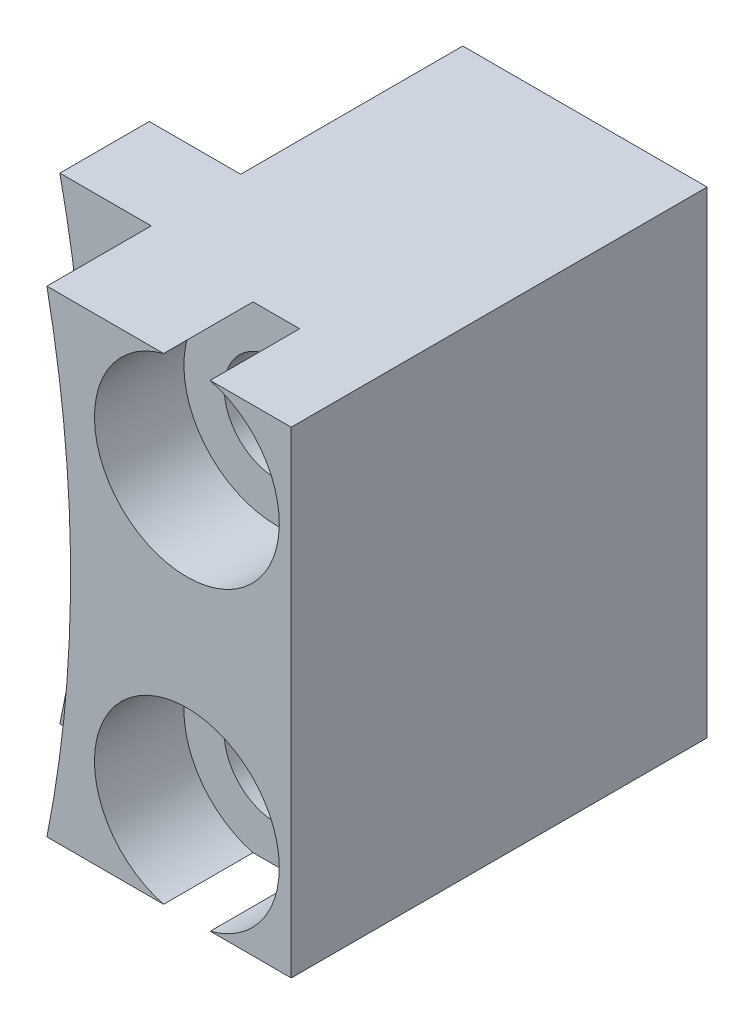
ISO-10303-21;
HEADER;
FILE_DESCRIPTION(('STEP AP214'),'2;1');
FILE_NAME('part.step','',(''),(''),'','','');
FILE_SCHEMA(('AUTOMOTIVE_DESIGN { 1 0 10303 214 1 1 1 1 }'));
ENDSEC;
DATA;
#1=APPLICATION_CONTEXT('core data for automotive mechanical design processes');
#2=APPLICATION_PROTOCOL_DEFINITION('international standard','automotive_design',2000,#1);
#3=PRODUCT_CONTEXT('',#1,'mechanical');
#4=PRODUCT('Part','Part','',(#3));
#5=PRODUCT_RELATED_PRODUCT_CATEGORY('part','',(#4));
#6=PRODUCT_DEFINITION_FORMATION('','',#4);
#7=PRODUCT_DEFINITION_CONTEXT('part definition',#1,'design');
#8=PRODUCT_DEFINITION('design','',#6,#7);
#9=PRODUCT_DEFINITION_SHAPE('','',#8);
#10=(LENGTH_UNIT() NAMED_UNIT(*) SI_UNIT(.MILLI.,.METRE.));
#11=(NAMED_UNIT(*) PLANE_ANGLE_UNIT() SI_UNIT($,.RADIAN.));
#12=(NAMED_UNIT(*) SI_UNIT($,.STERADIAN.) SOLID_ANGLE_UNIT());
#13=UNCERTAINTY_MEASURE_WITH_UNIT(LENGTH_MEASURE(1.E-05),#10,'distance_accuracy_value','');
#14=(GEOMETRIC_REPRESENTATION_CONTEXT(3) GLOBAL_UNCERTAINTY_ASSIGNED_CONTEXT((#13)) GLOBAL_UNIT_ASSIGNED_CONTEXT((#10,
#11,#12)) REPRESENTATION_CONTEXT('',''));
#15=CARTESIAN_POINT('',(0.,0.,0.));
#16=DIRECTION('',(0.,0.,1.));
#17=DIRECTION('',(1.,0.,0.));
#18=AXIS2_PLACEMENT_3D('',#15,#16,#17);
#19=CARTESIAN_POINT('',(44.5,5.,57.));
#20=DIRECTION('',(0.,0.,1.));
#21=DIRECTION('',(1.,0.,0.));
#22=AXIS2_PLACEMENT_3D('',#19,#20,#21);
#23=PLANE('',#22);
#24=CARTESIAN_POINT('',(44.5,5.,57.));
#25=DIRECTION('',(0.,0.,1.));
#26=DIRECTION('',(1.,0.,0.));
#27=AXIS2_PLACEMENT_3D('',#24,#25,#26);
#28=CIRCLE('',#27,1.75);
#29=CARTESIAN_POINT('',(46.25,5.,57.));
#30=VERTEX_POINT('',#29);
#31=EDGE_CURVE('E19',#30,#30,#28,.T.);
#32=ORIENTED_EDGE('',*,*,#31,.F.);
#33=EDGE_LOOP('',(#32));
#34=FACE_BOUND('',#33,.T.);
#35=DIRECTION('',(1.,0.,0.));
#36=VECTOR('',#35,1.);
#37=CARTESIAN_POINT('',(41.25,8.,57.));
#38=LINE('',#37,#36);
#39=CARTESIAN_POINT('',(43.718975032409,8.,57.));
#40=VERTEX_POINT('',#39);
#41=CARTESIAN_POINT('',(45.281024967591,8.,57.));
#42=VERTEX_POINT('',#41);
#43=EDGE_CURVE('E237',#40,#42,#38,.T.);
#44=ORIENTED_EDGE('',*,*,#43,.F.);
#45=CARTESIAN_POINT('',(44.5,5.,57.));
#46=DIRECTION('',(0.,0.,-1.));
#47=DIRECTION('',(0.251943537931998,0.967741935483994,0.));
#48=AXIS2_PLACEMENT_3D('',#45,#46,#47);
#49=CIRCLE('',#48,3.1);
#50=EDGE_CURVE('E10',#42,#40,#49,.T.);
#51=ORIENTED_EDGE('',*,*,#50,.F.);
#52=EDGE_LOOP('',(#44,#51));
#53=FACE_BOUND('',#52,.T.);
#54=ADVANCED_FACE('F16',(#34,#53),#23,.T.);
#55=CARTESIAN_POINT('',(44.5,5.,57.));
#56=DIRECTION('',(0.,0.,1.));
#57=DIRECTION('',(1.,0.,0.));
#58=AXIS2_PLACEMENT_3D('',#55,#56,#57);
#59=CYLINDRICAL_SURFACE('',#58,3.1);
#60=DIRECTION('',(0.,0.,1.));
#61=VECTOR('',#60,1.);
#62=CARTESIAN_POINT('',(43.718975032409,8.,57.));
#63=LINE('',#62,#61);
#64=CARTESIAN_POINT('',(43.71897503241,8.,60.));
#65=VERTEX_POINT('',#64);
#66=EDGE_CURVE('E234',#40,#65,#63,.T.);
#67=ORIENTED_EDGE('',*,*,#66,.T.);
#68=CARTESIAN_POINT('',(44.5,5.,60.));
#69=DIRECTION('',(0.,0.,-1.));
#70=DIRECTION('',(0.251943537931998,0.967741935483994,0.));
#71=AXIS2_PLACEMENT_3D('',#68,#69,#70);
#72=CIRCLE('',#71,3.1);
#73=CARTESIAN_POINT('',(45.28102496759,8.,60.));
#74=VERTEX_POINT('',#73);
#75=EDGE_CURVE('E161',#74,#65,#72,.T.);
#76=ORIENTED_EDGE('',*,*,#75,.F.);
#77=DIRECTION('',(0.,0.,1.));
#78=VECTOR('',#77,1.);
#79=CARTESIAN_POINT('',(45.281024967591,8.,57.));
#80=LINE('',#79,#78);
#81=EDGE_CURVE('E156',#42,#74,#80,.T.);
#82=ORIENTED_EDGE('',*,*,#81,.F.);
#83=ORIENTED_EDGE('',*,*,#50,.T.);
#84=EDGE_LOOP('',(#67,#76,#82,#83));
#85=FACE_BOUND('',#84,.T.);
#86=ADVANCED_FACE('F281',(#85),#59,.F.);
#87=CARTESIAN_POINT('',(44.5,5.,46.));
#88=DIRECTION('',(0.,0.,1.));
#89=DIRECTION('',(1.,0.,0.));
#90=AXIS2_PLACEMENT_3D('',#87,#88,#89);
#91=CYLINDRICAL_SURFACE('',#90,1.75);
#92=DIRECTION('',(0.,0.,1.));
#93=VECTOR('',#92,1.);
#94=CARTESIAN_POINT('',(46.25,5.,46.));
#95=LINE('',#94,#93);
#96=CARTESIAN_POINT('',(46.25,5.,46.05));
#97=VERTEX_POINT('',#96);
#98=EDGE_CURVE('E244',#97,#30,#95,.T.);
#99=ORIENTED_EDGE('',*,*,#98,.F.);
#100=CARTESIAN_POINT('',(44.5,5.,46.05));
#101=DIRECTION('',(0.,0.,1.));
#102=DIRECTION('',(1.,0.,0.));
#103=AXIS2_PLACEMENT_3D('',#100,#101,#102);
#104=CIRCLE('',#103,1.75);
#105=EDGE_CURVE('E180',#97,#97,#104,.T.);
#106=ORIENTED_EDGE('',*,*,#105,.F.);
#107=ORIENTED_EDGE('',*,*,#98,.T.);
#108=ORIENTED_EDGE('',*,*,#31,.T.);
#109=EDGE_LOOP('',(#99,#106,#107,#108));
#110=FACE_BOUND('',#109,.T.);
#111=ADVANCED_FACE('F276',(#110),#91,.F.);
#112=CARTESIAN_POINT('',(44.5,-5.,46.));
#113=DIRECTION('',(0.,0.,1.));
#114=DIRECTION('',(1.,0.,0.));
#115=AXIS2_PLACEMENT_3D('',#112,#113,#114);
#116=CYLINDRICAL_SURFACE('',#115,1.75);
#117=DIRECTION('',(0.,0.,1.));
#118=VECTOR('',#117,1.);
#119=CARTESIAN_POINT('',(46.25,-5.,46.));
#120=LINE('',#119,#118);
#121=CARTESIAN_POINT('',(46.25,-5.,46.05));
#122=VERTEX_POINT('',#121);
#123=CARTESIAN_POINT('',(46.25,-5.,57.));
#124=VERTEX_POINT('',#123);
#125=EDGE_CURVE('E242',#122,#124,#120,.T.);
#126=ORIENTED_EDGE('',*,*,#125,.F.);
#127=CARTESIAN_POINT('',(44.5,-5.,46.05));
#128=DIRECTION('',(0.,0.,1.));
#129=DIRECTION('',(1.,0.,0.));
#130=AXIS2_PLACEMENT_3D('',#127,#128,#129);
#131=CIRCLE('',#130,1.75);
#132=EDGE_CURVE('E185',#122,#122,#131,.T.);
#133=ORIENTED_EDGE('',*,*,#132,.F.);
#134=ORIENTED_EDGE('',*,*,#125,.T.);
#135=CARTESIAN_POINT('',(44.5,-5.,57.));
#136=DIRECTION('',(0.,0.,1.));
#137=DIRECTION('',(1.,0.,0.));
#138=AXIS2_PLACEMENT_3D('',#135,#136,#137);
#139=CIRCLE('',#138,1.75);
#140=EDGE_CURVE('E200',#124,#124,#139,.T.);
#141=ORIENTED_EDGE('',*,*,#140,.T.);
#142=EDGE_LOOP('',(#126,#133,#134,#141));
#143=FACE_BOUND('',#142,.T.);
#144=ADVANCED_FACE('F280',(#143),#116,.F.);
#145=CARTESIAN_POINT('',(38.,8.,46.05));
#146=DIRECTION('',(0.,1.,0.));
#147=DIRECTION('',(1.,0.,0.));
#148=AXIS2_PLACEMENT_3D('',#145,#146,#147);
#149=PLANE('',#148);
#150=DIRECTION('',(1.,0.,0.));
#151=VECTOR('',#150,1.);
#152=CARTESIAN_POINT('',(38.,8.,46.05));
#153=LINE('',#152,#151);
#154=CARTESIAN_POINT('',(39.804019897493,8.,46.05));
#155=VERTEX_POINT('',#154);
#156=CARTESIAN_POINT('',(48.,8.,46.05));
#157=VERTEX_POINT('',#156);
#158=EDGE_CURVE('E489',#155,#157,#153,.T.);
#159=ORIENTED_EDGE('',*,*,#158,.F.);
#160=DIRECTION('',(0.,0.,1.));
#161=VECTOR('',#160,1.);
#162=CARTESIAN_POINT('',(39.804019897493,8.,46.));
#163=LINE('',#162,#161);
#164=CARTESIAN_POINT('',(39.804019897493,8.,53.5));
#165=VERTEX_POINT('',#164);
#166=EDGE_CURVE('E231',#155,#165,#163,.T.);
#167=ORIENTED_EDGE('',*,*,#166,.T.);
#168=DIRECTION('',(1.,0.,0.));
#169=VECTOR('',#168,1.);
#170=CARTESIAN_POINT('',(30.,8.,53.5));
#171=LINE('',#170,#169);
#172=CARTESIAN_POINT('',(36.739080010256,8.000000000001,53.5));
#173=VERTEX_POINT('',#172);
#174=EDGE_CURVE('E226',#173,#165,#171,.T.);
#175=ORIENTED_EDGE('',*,*,#174,.F.);
#176=DIRECTION('',(0.,0.,1.));
#177=VECTOR('',#176,1.);
#178=CARTESIAN_POINT('',(36.739080010256,8.,52.5));
#179=LINE('',#178,#177);
#180=CARTESIAN_POINT('',(36.739080010256,8.000000000001,56.5));
#181=VERTEX_POINT('',#180);
#182=EDGE_CURVE('E219',#173,#181,#179,.T.);
#183=ORIENTED_EDGE('',*,*,#182,.T.);
#184=DIRECTION('',(1.,0.,0.));
#185=VECTOR('',#184,1.);
#186=CARTESIAN_POINT('',(30.,8.,56.5));
#187=LINE('',#186,#185);
#188=CARTESIAN_POINT('',(39.804019897493,8.,56.5));
#189=VERTEX_POINT('',#188);
#190=EDGE_CURVE('E213',#181,#189,#187,.T.);
#191=ORIENTED_EDGE('',*,*,#190,.T.);
#192=DIRECTION('',(0.,0.,1.));
#193=VECTOR('',#192,1.);
#194=CARTESIAN_POINT('',(39.804019897493,8.,46.));
#195=LINE('',#194,#193);
#196=CARTESIAN_POINT('',(39.804019897493,8.,60.));
#197=VERTEX_POINT('',#196);
#198=EDGE_CURVE('E206',#189,#197,#195,.T.);
#199=ORIENTED_EDGE('',*,*,#198,.T.);
#200=DIRECTION('',(1.,0.,0.));
#201=VECTOR('',#200,1.);
#202=CARTESIAN_POINT('',(38.,8.,60.));
#203=LINE('',#202,#201);
#204=EDGE_CURVE('E174',#197,#65,#203,.T.);
#205=ORIENTED_EDGE('',*,*,#204,.T.);
#206=ORIENTED_EDGE('',*,*,#66,.F.);
#207=ORIENTED_EDGE('',*,*,#43,.T.);
#208=ORIENTED_EDGE('',*,*,#81,.T.);
#209=DIRECTION('',(1.,0.,0.));
#210=VECTOR('',#209,1.);
#211=CARTESIAN_POINT('',(38.,8.,60.));
#212=LINE('',#211,#210);
#213=CARTESIAN_POINT('',(48.,8.,60.));
#214=VERTEX_POINT('',#213);
#215=EDGE_CURVE('E148',#74,#214,#212,.T.);
#216=ORIENTED_EDGE('',*,*,#215,.T.);
#217=DIRECTION('',(0.,0.,1.));
#218=VECTOR('',#217,1.);
#219=CARTESIAN_POINT('',(48.,8.,46.05));
#220=LINE('',#219,#218);
#221=EDGE_CURVE('E153',#157,#214,#220,.T.);
#222=ORIENTED_EDGE('',*,*,#221,.F.);
#223=EDGE_LOOP('',(#159,#167,#175,#183,#191,#199,#205,#206,#207,#208,#216,#222));
#224=FACE_BOUND('',#223,.T.);
#225=ADVANCED_FACE('F151',(#224),#149,.T.);
#226=CARTESIAN_POINT('',(0.,0.,46.));
#227=DIRECTION('',(0.,0.,1.));
#228=DIRECTION('',(1.,0.,0.));
#229=AXIS2_PLACEMENT_3D('',#226,#227,#228);
#230=CYLINDRICAL_SURFACE('',#229,40.6);
#231=CARTESIAN_POINT('',(0.,0.,53.5));
#232=DIRECTION('',(0.,0.,1.));
#233=DIRECTION('',(1.,0.,0.));
#234=AXIS2_PLACEMENT_3D('',#231,#232,#233);
#235=CIRCLE('',#234,40.6);
#236=CARTESIAN_POINT('',(39.804019897493,-8.,53.5));
#237=VERTEX_POINT('',#236);
#238=EDGE_CURVE('E230',#237,#165,#235,.T.);
#239=ORIENTED_EDGE('',*,*,#238,.T.);
#240=ORIENTED_EDGE('',*,*,#166,.F.);
#241=CARTESIAN_POINT('',(0.,0.,46.05));
#242=DIRECTION('',(0.,0.,1.));
#243=DIRECTION('',(0.980394578756052,-0.197044334975011,0.));
#244=AXIS2_PLACEMENT_3D('',#241,#242,#243);
#245=CIRCLE('',#244,40.6);
#246=CARTESIAN_POINT('',(39.804019897493,-8.,46.05));
#247=VERTEX_POINT('',#246);
#248=EDGE_CURVE('E468',#247,#155,#245,.T.);
#249=ORIENTED_EDGE('',*,*,#248,.F.);
#250=DIRECTION('',(0.,0.,1.));
#251=VECTOR('',#250,1.);
#252=CARTESIAN_POINT('',(39.804019897493,-8.,46.));
#253=LINE('',#252,#251);
#254=EDGE_CURVE('E478',#247,#237,#253,.T.);
#255=ORIENTED_EDGE('',*,*,#254,.T.);
#256=EDGE_LOOP('',(#239,#240,#249,#255));
#257=FACE_BOUND('',#256,.T.);
#258=ADVANCED_FACE('F333',(#257),#230,.F.);
#259=CARTESIAN_POINT('',(0.,0.,53.5));
#260=DIRECTION('',(0.,0.,1.));
#261=DIRECTION('',(1.,0.,0.));
#262=AXIS2_PLACEMENT_3D('',#259,#260,#261);
#263=PLANE('',#262);
#264=CARTESIAN_POINT('',(0.,0.,53.5));
#265=DIRECTION('',(0.,0.,1.));
#266=DIRECTION('',(0.977103191762085,-0.212765957447019,0.));
#267=AXIS2_PLACEMENT_3D('',#264,#265,#266);
#268=CIRCLE('',#267,37.6);
#269=CARTESIAN_POINT('',(36.739080010256,-8.000000000001,53.5));
#270=VERTEX_POINT('',#269);
#271=EDGE_CURVE('E222',#270,#173,#268,.T.);
#272=ORIENTED_EDGE('',*,*,#271,.T.);
#273=ORIENTED_EDGE('',*,*,#174,.T.);
#274=ORIENTED_EDGE('',*,*,#238,.F.);
#275=DIRECTION('',(1.,0.,0.));
#276=VECTOR('',#275,1.);
#277=CARTESIAN_POINT('',(30.,-8.,53.5));
#278=LINE('',#277,#276);
#279=EDGE_CURVE('E479',#270,#237,#278,.T.);
#280=ORIENTED_EDGE('',*,*,#279,.F.);
#281=EDGE_LOOP('',(#272,#273,#274,#280));
#282=FACE_BOUND('',#281,.T.);
#283=ADVANCED_FACE('F337',(#282),#263,.F.);
#284=CARTESIAN_POINT('',(0.,0.,52.5));
#285=DIRECTION('',(0.,0.,1.));
#286=DIRECTION('',(1.,0.,0.));
#287=AXIS2_PLACEMENT_3D('',#284,#285,#286);
#288=CYLINDRICAL_SURFACE('',#287,37.6);
#289=DIRECTION('',(0.,0.,1.));
#290=VECTOR('',#289,1.);
#291=CARTESIAN_POINT('',(36.739080010256,-8.,52.5));
#292=LINE('',#291,#290);
#293=CARTESIAN_POINT('',(36.739080010256,-8.000000000001,56.5));
#294=VERTEX_POINT('',#293);
#295=EDGE_CURVE('E473',#270,#294,#292,.T.);
#296=ORIENTED_EDGE('',*,*,#295,.T.);
#297=CARTESIAN_POINT('',(0.,0.,56.5));
#298=DIRECTION('',(0.,0.,-1.));
#299=DIRECTION('',(0.977103191762085,0.212765957447019,0.));
#300=AXIS2_PLACEMENT_3D('',#297,#298,#299);
#301=CIRCLE('',#300,37.6);
#302=EDGE_CURVE('E216',#181,#294,#301,.T.);
#303=ORIENTED_EDGE('',*,*,#302,.F.);
#304=ORIENTED_EDGE('',*,*,#182,.F.);
#305=ORIENTED_EDGE('',*,*,#271,.F.);
#306=EDGE_LOOP('',(#296,#303,#304,#305));
#307=FACE_BOUND('',#306,.T.);
#308=ADVANCED_FACE('F351',(#307),#288,.F.);
#309=CARTESIAN_POINT('',(0.,0.,56.5));
#310=DIRECTION('',(0.,0.,1.));
#311=DIRECTION('',(1.,0.,0.));
#312=AXIS2_PLACEMENT_3D('',#309,#310,#311);
#313=PLANE('',#312);
#314=DIRECTION('',(1.,0.,0.));
#315=VECTOR('',#314,1.);
#316=CARTESIAN_POINT('',(30.,-8.,56.5));
#317=LINE('',#316,#315);
#318=CARTESIAN_POINT('',(39.804019897493,-8.,56.5));
#319=VERTEX_POINT('',#318);
#320=EDGE_CURVE('E455',#294,#319,#317,.T.);
#321=ORIENTED_EDGE('',*,*,#320,.T.);
#322=CARTESIAN_POINT('',(0.,0.,56.5));
#323=DIRECTION('',(0.,0.,1.));
#324=DIRECTION('',(1.,0.,0.));
#325=AXIS2_PLACEMENT_3D('',#322,#323,#324);
#326=CIRCLE('',#325,40.6);
#327=EDGE_CURVE('E209',#319,#189,#326,.T.);
#328=ORIENTED_EDGE('',*,*,#327,.T.);
#329=ORIENTED_EDGE('',*,*,#190,.F.);
#330=ORIENTED_EDGE('',*,*,#302,.T.);
#331=EDGE_LOOP('',(#321,#328,#329,#330));
#332=FACE_BOUND('',#331,.T.);
#333=ADVANCED_FACE('F259',(#332),#313,.T.);
#334=CARTESIAN_POINT('',(0.,0.,46.));
#335=DIRECTION('',(0.,0.,1.));
#336=DIRECTION('',(1.,0.,0.));
#337=AXIS2_PLACEMENT_3D('',#334,#335,#336);
#338=CYLINDRICAL_SURFACE('',#337,40.6);
#339=CARTESIAN_POINT('',(0.,0.,60.));
#340=DIRECTION('',(0.,0.,-1.));
#341=DIRECTION('',(0.980394578756052,0.197044334975011,0.));
#342=AXIS2_PLACEMENT_3D('',#339,#340,#341);
#343=CIRCLE('',#342,40.6);
#344=CARTESIAN_POINT('',(39.804019897493,-8.,60.));
#345=VERTEX_POINT('',#344);
#346=EDGE_CURVE('E192',#197,#345,#343,.T.);
#347=ORIENTED_EDGE('',*,*,#346,.F.);
#348=ORIENTED_EDGE('',*,*,#198,.F.);
#349=ORIENTED_EDGE('',*,*,#327,.F.);
#350=DIRECTION('',(0.,0.,1.));
#351=VECTOR('',#350,1.);
#352=CARTESIAN_POINT('',(39.804019897493,-8.,46.));
#353=LINE('',#352,#351);
#354=EDGE_CURVE('E451',#319,#345,#353,.T.);
#355=ORIENTED_EDGE('',*,*,#354,.T.);
#356=EDGE_LOOP('',(#347,#348,#349,#355));
#357=FACE_BOUND('',#356,.T.);
#358=ADVANCED_FACE('F253',(#357),#338,.F.);
#359=CARTESIAN_POINT('',(44.5,-5.,57.));
#360=DIRECTION('',(0.,0.,1.));
#361=DIRECTION('',(1.,0.,0.));
#362=AXIS2_PLACEMENT_3D('',#359,#360,#361);
#363=PLANE('',#362);
#364=ORIENTED_EDGE('',*,*,#140,.F.);
#365=EDGE_LOOP('',(#364));
#366=FACE_BOUND('',#365,.T.);
#367=DIRECTION('',(1.,0.,0.));
#368=VECTOR('',#367,1.);
#369=CARTESIAN_POINT('',(41.25,-8.,57.));
#370=LINE('',#369,#368);
#371=CARTESIAN_POINT('',(43.718975032409,-8.,57.));
#372=VERTEX_POINT('',#371);
#373=CARTESIAN_POINT('',(45.281024967591,-8.,57.));
#374=VERTEX_POINT('',#373);
#375=EDGE_CURVE('E465',#372,#374,#370,.T.);
#376=ORIENTED_EDGE('',*,*,#375,.T.);
#377=CARTESIAN_POINT('',(44.5,-5.,57.));
#378=DIRECTION('',(0.,0.,-1.));
#379=DIRECTION('',(-0.251943537931998,-0.967741935483994,0.));
#380=AXIS2_PLACEMENT_3D('',#377,#378,#379);
#381=CIRCLE('',#380,3.1);
#382=EDGE_CURVE('E197',#372,#374,#381,.T.);
#383=ORIENTED_EDGE('',*,*,#382,.F.);
#384=EDGE_LOOP('',(#376,#383));
#385=FACE_BOUND('',#384,.T.);
#386=ADVANCED_FACE('F258',(#366,#385),#363,.T.);
#387=CARTESIAN_POINT('',(44.5,-5.,57.));
#388=DIRECTION('',(0.,0.,1.));
#389=DIRECTION('',(1.,0.,0.));
#390=AXIS2_PLACEMENT_3D('',#387,#388,#389);
#391=CYLINDRICAL_SURFACE('',#390,3.1);
#392=DIRECTION('',(0.,0.,1.));
#393=VECTOR('',#392,1.);
#394=CARTESIAN_POINT('',(45.281024967591,-8.,57.));
#395=LINE('',#394,#393);
#396=CARTESIAN_POINT('',(45.28102496759,-8.,60.));
#397=VERTEX_POINT('',#396);
#398=EDGE_CURVE('E510',#374,#397,#395,.T.);
#399=ORIENTED_EDGE('',*,*,#398,.T.);
#400=CARTESIAN_POINT('',(44.5,-5.,60.));
#401=DIRECTION('',(0.,0.,-1.));
#402=DIRECTION('',(-0.251943537931998,-0.967741935483994,0.));
#403=AXIS2_PLACEMENT_3D('',#400,#401,#402);
#404=CIRCLE('',#403,3.1);
#405=CARTESIAN_POINT('',(43.71897503241,-8.,60.));
#406=VERTEX_POINT('',#405);
#407=EDGE_CURVE('E162',#406,#397,#404,.T.);
#408=ORIENTED_EDGE('',*,*,#407,.F.);
#409=DIRECTION('',(0.,0.,1.));
#410=VECTOR('',#409,1.);
#411=CARTESIAN_POINT('',(43.718975032409,-8.,57.));
#412=LINE('',#411,#410);
#413=EDGE_CURVE('E459',#372,#406,#412,.T.);
#414=ORIENTED_EDGE('',*,*,#413,.F.);
#415=ORIENTED_EDGE('',*,*,#382,.T.);
#416=EDGE_LOOP('',(#399,#408,#414,#415));
#417=FACE_BOUND('',#416,.T.);
#418=ADVANCED_FACE('F320',(#417),#391,.F.);
#419=CARTESIAN_POINT('',(38.,-8.,60.));
#420=DIRECTION('',(0.,0.,1.));
#421=DIRECTION('',(1.,0.,0.));
#422=AXIS2_PLACEMENT_3D('',#419,#420,#421);
#423=PLANE('',#422);
#424=ORIENTED_EDGE('',*,*,#204,.F.);
#425=ORIENTED_EDGE('',*,*,#346,.T.);
#426=DIRECTION('',(1.,0.,0.));
#427=VECTOR('',#426,1.);
#428=CARTESIAN_POINT('',(38.,-8.,60.));
#429=LINE('',#428,#427);
#430=EDGE_CURVE('E447',#345,#406,#429,.T.);
#431=ORIENTED_EDGE('',*,*,#430,.T.);
#432=ORIENTED_EDGE('',*,*,#407,.T.);
#433=DIRECTION('',(1.,0.,0.));
#434=VECTOR('',#433,1.);
#435=CARTESIAN_POINT('',(38.,-8.,60.));
#436=LINE('',#435,#434);
#437=CARTESIAN_POINT('',(48.,-8.,60.));
#438=VERTEX_POINT('',#437);
#439=EDGE_CURVE('E169',#397,#438,#436,.T.);
#440=ORIENTED_EDGE('',*,*,#439,.T.);
#441=DIRECTION('',(0.,1.,0.));
#442=VECTOR('',#441,1.);
#443=CARTESIAN_POINT('',(48.,-8.,60.));
#444=LINE('',#443,#442);
#445=EDGE_CURVE('E165',#438,#214,#444,.T.);
#446=ORIENTED_EDGE('',*,*,#445,.T.);
#447=ORIENTED_EDGE('',*,*,#215,.F.);
#448=ORIENTED_EDGE('',*,*,#75,.T.);
#449=EDGE_LOOP('',(#424,#425,#431,#432,#440,#446,#447,#448));
#450=FACE_BOUND('',#449,.T.);
#451=ADVANCED_FACE('F167',(#450),#423,.T.);
#452=CARTESIAN_POINT('',(48.,-8.,46.05));
#453=DIRECTION('',(1.,0.,0.));
#454=DIRECTION('',(0.,1.,0.));
#455=AXIS2_PLACEMENT_3D('',#452,#453,#454);
#456=PLANE('',#455);
#457=DIRECTION('',(0.,0.,1.));
#458=VECTOR('',#457,1.);
#459=CARTESIAN_POINT('',(48.,-8.,46.05));
#460=LINE('',#459,#458);
#461=CARTESIAN_POINT('',(48.,-8.,46.05));
#462=VERTEX_POINT('',#461);
#463=EDGE_CURVE('E505',#462,#438,#460,.T.);
#464=ORIENTED_EDGE('',*,*,#463,.F.);
#465=DIRECTION('',(0.,1.,0.));
#466=VECTOR('',#465,1.);
#467=CARTESIAN_POINT('',(48.,-8.,46.05));
#468=LINE('',#467,#466);
#469=EDGE_CURVE('E178',#462,#157,#468,.T.);
#470=ORIENTED_EDGE('',*,*,#469,.T.);
#471=ORIENTED_EDGE('',*,*,#221,.T.);
#472=ORIENTED_EDGE('',*,*,#445,.F.);
#473=EDGE_LOOP('',(#464,#470,#471,#472));
#474=FACE_BOUND('',#473,.T.);
#475=ADVANCED_FACE('F177',(#474),#456,.T.);
#476=CARTESIAN_POINT('',(38.,-8.,46.05));
#477=DIRECTION('',(0.,0.,1.));
#478=DIRECTION('',(1.,0.,0.));
#479=AXIS2_PLACEMENT_3D('',#476,#477,#478);
#480=PLANE('',#479);
#481=ORIENTED_EDGE('',*,*,#105,.T.);
#482=EDGE_LOOP('',(#481));
#483=FACE_BOUND('',#482,.T.);
#484=ORIENTED_EDGE('',*,*,#132,.T.);
#485=EDGE_LOOP('',(#484));
#486=FACE_BOUND('',#485,.T.);
#487=ORIENTED_EDGE('',*,*,#469,.F.);
#488=DIRECTION('',(1.,0.,0.));
#489=VECTOR('',#488,1.);
#490=CARTESIAN_POINT('',(38.,-8.,46.05));
#491=LINE('',#490,#489);
#492=EDGE_CURVE('E474',#247,#462,#491,.T.);
#493=ORIENTED_EDGE('',*,*,#492,.F.);
#494=ORIENTED_EDGE('',*,*,#248,.T.);
#495=ORIENTED_EDGE('',*,*,#158,.T.);
#496=EDGE_LOOP('',(#487,#493,#494,#495));
#497=FACE_BOUND('',#496,.T.);
#498=ADVANCED_FACE('F270',(#483,#486,#497),#480,.F.);
#499=CARTESIAN_POINT('',(38.,-8.,46.05));
#500=DIRECTION('',(0.,1.,0.));
#501=DIRECTION('',(1.,0.,0.));
#502=AXIS2_PLACEMENT_3D('',#499,#500,#501);
#503=PLANE('',#502);
#504=ORIENTED_EDGE('',*,*,#463,.T.);
#505=ORIENTED_EDGE('',*,*,#439,.F.);
#506=ORIENTED_EDGE('',*,*,#398,.F.);
#507=ORIENTED_EDGE('',*,*,#375,.F.);
#508=ORIENTED_EDGE('',*,*,#413,.T.);
#509=ORIENTED_EDGE('',*,*,#430,.F.);
#510=ORIENTED_EDGE('',*,*,#354,.F.);
#511=ORIENTED_EDGE('',*,*,#320,.F.);
#512=ORIENTED_EDGE('',*,*,#295,.F.);
#513=ORIENTED_EDGE('',*,*,#279,.T.);
#514=ORIENTED_EDGE('',*,*,#254,.F.);
#515=ORIENTED_EDGE('',*,*,#492,.T.);
#516=EDGE_LOOP('',(#504,#505,#506,#507,#508,#509,#510,#511,#512,#513,#514,#515));
#517=FACE_BOUND('',#516,.T.);
#518=ADVANCED_FACE('F266',(#517),#503,.F.);
#519=CLOSED_SHELL('',(#54,#86,#111,#144,#225,#258,#283,#308,#333,#358,#386,#418,#451,#475,#498,#518));
#520=MANIFOLD_SOLID_BREP('B1',#519);
#521=ADVANCED_BREP_SHAPE_REPRESENTATION('',(#18,#520),#14);
#522=SHAPE_DEFINITION_REPRESENTATION(#9,#521);
ENDSEC;
END-ISO-10303-21;
